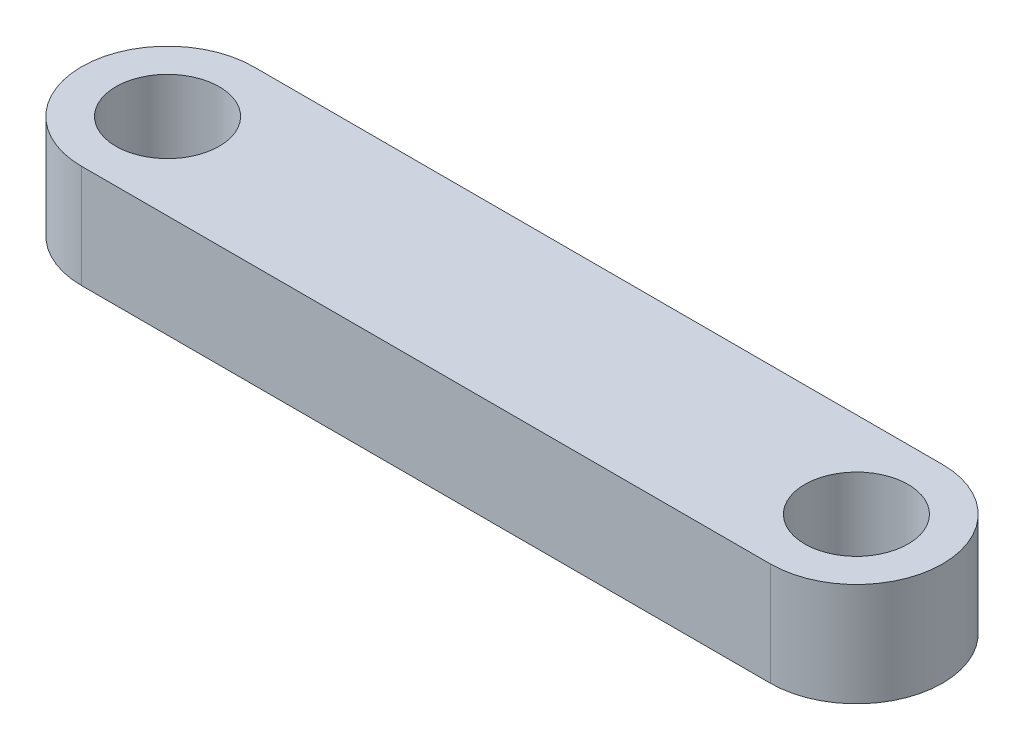
ISO-10303-21;
HEADER;
FILE_DESCRIPTION(('STEP AP214'),'2;1');
FILE_NAME('part.step','',(''),(''),'','','');
FILE_SCHEMA(('AUTOMOTIVE_DESIGN { 1 0 10303 214 1 1 1 1 }'));
ENDSEC;
DATA;
#1=APPLICATION_CONTEXT('core data for automotive mechanical design processes');
#2=APPLICATION_PROTOCOL_DEFINITION('international standard','automotive_design',2000,#1);
#3=PRODUCT_CONTEXT('',#1,'mechanical');
#4=PRODUCT('Part','Part','',(#3));
#5=PRODUCT_RELATED_PRODUCT_CATEGORY('part','',(#4));
#6=PRODUCT_DEFINITION_FORMATION('','',#4);
#7=PRODUCT_DEFINITION_CONTEXT('part definition',#1,'design');
#8=PRODUCT_DEFINITION('design','',#6,#7);
#9=PRODUCT_DEFINITION_SHAPE('','',#8);
#10=(LENGTH_UNIT() NAMED_UNIT(*) SI_UNIT(.MILLI.,.METRE.));
#11=(NAMED_UNIT(*) PLANE_ANGLE_UNIT() SI_UNIT($,.RADIAN.));
#12=(NAMED_UNIT(*) SI_UNIT($,.STERADIAN.) SOLID_ANGLE_UNIT());
#13=UNCERTAINTY_MEASURE_WITH_UNIT(LENGTH_MEASURE(1.E-05),#10,'distance_accuracy_value','');
#14=(GEOMETRIC_REPRESENTATION_CONTEXT(3) GLOBAL_UNCERTAINTY_ASSIGNED_CONTEXT((#13)) GLOBAL_UNIT_ASSIGNED_CONTEXT((#10,
#11,#12)) REPRESENTATION_CONTEXT('',''));
#15=CARTESIAN_POINT('',(0.,0.,0.));
#16=DIRECTION('',(0.,0.,1.));
#17=DIRECTION('',(1.,0.,0.));
#18=AXIS2_PLACEMENT_3D('',#15,#16,#17);
#19=CARTESIAN_POINT('',(10.,1.5,0.));
#20=DIRECTION('',(0.,1.,0.));
#21=DIRECTION('',(0.,0.,1.));
#22=AXIS2_PLACEMENT_3D('',#19,#20,#21);
#23=PLANE('',#22);
#24=CARTESIAN_POINT('',(-10.,1.5,0.));
#25=DIRECTION('',(0.,1.,0.));
#26=DIRECTION('',(0.,0.,1.));
#27=AXIS2_PLACEMENT_3D('',#24,#25,#26);
#28=CIRCLE('',#27,1.5);
#29=CARTESIAN_POINT('',(-10.,1.5,1.5));
#30=VERTEX_POINT('',#29);
#31=EDGE_CURVE('E112',#30,#30,#28,.T.);
#32=ORIENTED_EDGE('',*,*,#31,.F.);
#33=EDGE_LOOP('',(#32));
#34=FACE_BOUND('',#33,.T.);
#35=CARTESIAN_POINT('',(10.,1.5,0.));
#36=DIRECTION('',(0.,1.,0.));
#37=DIRECTION('',(0.,0.,1.));
#38=AXIS2_PLACEMENT_3D('',#35,#36,#37);
#39=CIRCLE('',#38,2.5);
#40=CARTESIAN_POINT('',(10.,1.5,2.5));
#41=VERTEX_POINT('',#40);
#42=CARTESIAN_POINT('',(10.,1.5,-2.5));
#43=VERTEX_POINT('',#42);
#44=EDGE_CURVE('E92',#41,#43,#39,.T.);
#45=ORIENTED_EDGE('',*,*,#44,.T.);
#46=DIRECTION('',(-1.,0.,0.));
#47=VECTOR('',#46,1.);
#48=CARTESIAN_POINT('',(10.,1.5,-2.5));
#49=LINE('',#48,#47);
#50=CARTESIAN_POINT('',(-10.,1.5,-2.5));
#51=VERTEX_POINT('',#50);
#52=EDGE_CURVE('E87',#43,#51,#49,.T.);
#53=ORIENTED_EDGE('',*,*,#52,.T.);
#54=CARTESIAN_POINT('',(-10.,1.5,0.));
#55=DIRECTION('',(0.,1.,0.));
#56=DIRECTION('',(0.,0.,1.));
#57=AXIS2_PLACEMENT_3D('',#54,#55,#56);
#58=CIRCLE('',#57,2.5);
#59=CARTESIAN_POINT('',(-10.,1.5,2.5));
#60=VERTEX_POINT('',#59);
#61=EDGE_CURVE('E90',#51,#60,#58,.T.);
#62=ORIENTED_EDGE('',*,*,#61,.T.);
#63=DIRECTION('',(1.,0.,0.));
#64=VECTOR('',#63,1.);
#65=CARTESIAN_POINT('',(10.,1.5,2.5));
#66=LINE('',#65,#64);
#67=EDGE_CURVE('E57',#60,#41,#66,.T.);
#68=ORIENTED_EDGE('',*,*,#67,.T.);
#69=EDGE_LOOP('',(#45,#53,#62,#68));
#70=FACE_BOUND('',#69,.T.);
#71=CARTESIAN_POINT('',(10.,1.5,0.));
#72=DIRECTION('',(0.,1.,0.));
#73=DIRECTION('',(0.,0.,1.));
#74=AXIS2_PLACEMENT_3D('',#71,#72,#73);
#75=CIRCLE('',#74,1.5);
#76=CARTESIAN_POINT('',(10.,1.5,1.5));
#77=VERTEX_POINT('',#76);
#78=EDGE_CURVE('E134',#77,#77,#75,.T.);
#79=ORIENTED_EDGE('',*,*,#78,.F.);
#80=EDGE_LOOP('',(#79));
#81=FACE_BOUND('',#80,.T.);
#82=ADVANCED_FACE('F39',(#34,#70,#81),#23,.T.);
#83=CARTESIAN_POINT('',(10.,-1.5,0.));
#84=DIRECTION('',(0.,1.,0.));
#85=DIRECTION('',(0.,0.,1.));
#86=AXIS2_PLACEMENT_3D('',#83,#84,#85);
#87=PLANE('',#86);
#88=CARTESIAN_POINT('',(10.,-1.5,0.));
#89=DIRECTION('',(0.,1.,0.));
#90=DIRECTION('',(0.,0.,1.));
#91=AXIS2_PLACEMENT_3D('',#88,#89,#90);
#92=CIRCLE('',#91,2.5);
#93=CARTESIAN_POINT('',(10.,-1.5,2.5));
#94=VERTEX_POINT('',#93);
#95=CARTESIAN_POINT('',(10.,-1.5,-2.5));
#96=VERTEX_POINT('',#95);
#97=EDGE_CURVE('E108',#94,#96,#92,.T.);
#98=ORIENTED_EDGE('',*,*,#97,.F.);
#99=DIRECTION('',(1.,0.,0.));
#100=VECTOR('',#99,1.);
#101=CARTESIAN_POINT('',(10.,-1.5,2.5));
#102=LINE('',#101,#100);
#103=CARTESIAN_POINT('',(-10.,-1.5,2.5));
#104=VERTEX_POINT('',#103);
#105=EDGE_CURVE('E80',#104,#94,#102,.T.);
#106=ORIENTED_EDGE('',*,*,#105,.F.);
#107=CARTESIAN_POINT('',(-10.,-1.5,0.));
#108=DIRECTION('',(0.,1.,0.));
#109=DIRECTION('',(0.,0.,1.));
#110=AXIS2_PLACEMENT_3D('',#107,#108,#109);
#111=CIRCLE('',#110,2.5);
#112=CARTESIAN_POINT('',(-10.,-1.5,-2.5));
#113=VERTEX_POINT('',#112);
#114=EDGE_CURVE('E74',#113,#104,#111,.T.);
#115=ORIENTED_EDGE('',*,*,#114,.F.);
#116=DIRECTION('',(-1.,0.,0.));
#117=VECTOR('',#116,1.);
#118=CARTESIAN_POINT('',(10.,-1.5,-2.5));
#119=LINE('',#118,#117);
#120=EDGE_CURVE('E97',#96,#113,#119,.T.);
#121=ORIENTED_EDGE('',*,*,#120,.F.);
#122=EDGE_LOOP('',(#98,#106,#115,#121));
#123=FACE_BOUND('',#122,.T.);
#124=CARTESIAN_POINT('',(-10.,-1.5,0.));
#125=DIRECTION('',(0.,1.,0.));
#126=DIRECTION('',(0.,0.,1.));
#127=AXIS2_PLACEMENT_3D('',#124,#125,#126);
#128=CIRCLE('',#127,1.5);
#129=CARTESIAN_POINT('',(-10.,-1.5,1.5));
#130=VERTEX_POINT('',#129);
#131=EDGE_CURVE('E130',#130,#130,#128,.T.);
#132=ORIENTED_EDGE('',*,*,#131,.T.);
#133=EDGE_LOOP('',(#132));
#134=FACE_BOUND('',#133,.T.);
#135=CARTESIAN_POINT('',(10.,-1.5,0.));
#136=DIRECTION('',(0.,1.,0.));
#137=DIRECTION('',(0.,0.,1.));
#138=AXIS2_PLACEMENT_3D('',#135,#136,#137);
#139=CIRCLE('',#138,1.5);
#140=CARTESIAN_POINT('',(10.,-1.5,1.5));
#141=VERTEX_POINT('',#140);
#142=EDGE_CURVE('E138',#141,#141,#139,.T.);
#143=ORIENTED_EDGE('',*,*,#142,.T.);
#144=EDGE_LOOP('',(#143));
#145=FACE_BOUND('',#144,.T.);
#146=ADVANCED_FACE('F125',(#123,#134,#145),#87,.F.);
#147=CARTESIAN_POINT('',(10.,1.5,0.));
#148=DIRECTION('',(0.,-1.,0.));
#149=DIRECTION('',(0.,0.,-1.));
#150=AXIS2_PLACEMENT_3D('',#147,#148,#149);
#151=CYLINDRICAL_SURFACE('',#150,2.5);
#152=ORIENTED_EDGE('',*,*,#97,.T.);
#153=DIRECTION('',(0.,-1.,0.));
#154=VECTOR('',#153,1.);
#155=CARTESIAN_POINT('',(10.,1.5,-2.5));
#156=LINE('',#155,#154);
#157=EDGE_CURVE('E11',#43,#96,#156,.T.);
#158=ORIENTED_EDGE('',*,*,#157,.F.);
#159=ORIENTED_EDGE('',*,*,#44,.F.);
#160=DIRECTION('',(0.,-1.,0.));
#161=VECTOR('',#160,1.);
#162=CARTESIAN_POINT('',(10.,1.5,2.5));
#163=LINE('',#162,#161);
#164=EDGE_CURVE('E104',#41,#94,#163,.T.);
#165=ORIENTED_EDGE('',*,*,#164,.T.);
#166=EDGE_LOOP('',(#152,#158,#159,#165));
#167=FACE_BOUND('',#166,.T.);
#168=ADVANCED_FACE('F41',(#167),#151,.T.);
#169=CARTESIAN_POINT('',(10.,1.5,-2.5));
#170=DIRECTION('',(0.,0.,1.));
#171=DIRECTION('',(1.,0.,0.));
#172=AXIS2_PLACEMENT_3D('',#169,#170,#171);
#173=PLANE('',#172);
#174=ORIENTED_EDGE('',*,*,#120,.T.);
#175=DIRECTION('',(0.,-1.,0.));
#176=VECTOR('',#175,1.);
#177=CARTESIAN_POINT('',(-10.,1.5,-2.5));
#178=LINE('',#177,#176);
#179=EDGE_CURVE('E49',#51,#113,#178,.T.);
#180=ORIENTED_EDGE('',*,*,#179,.F.);
#181=ORIENTED_EDGE('',*,*,#52,.F.);
#182=ORIENTED_EDGE('',*,*,#157,.T.);
#183=EDGE_LOOP('',(#174,#180,#181,#182));
#184=FACE_BOUND('',#183,.T.);
#185=ADVANCED_FACE('F96',(#184),#173,.F.);
#186=CARTESIAN_POINT('',(-10.,1.5,0.));
#187=DIRECTION('',(0.,-1.,0.));
#188=DIRECTION('',(0.,0.,-1.));
#189=AXIS2_PLACEMENT_3D('',#186,#187,#188);
#190=CYLINDRICAL_SURFACE('',#189,2.5);
#191=ORIENTED_EDGE('',*,*,#114,.T.);
#192=DIRECTION('',(0.,-1.,0.));
#193=VECTOR('',#192,1.);
#194=CARTESIAN_POINT('',(-10.,1.5,2.5));
#195=LINE('',#194,#193);
#196=EDGE_CURVE('E99',#60,#104,#195,.T.);
#197=ORIENTED_EDGE('',*,*,#196,.F.);
#198=ORIENTED_EDGE('',*,*,#61,.F.);
#199=ORIENTED_EDGE('',*,*,#179,.T.);
#200=EDGE_LOOP('',(#191,#197,#198,#199));
#201=FACE_BOUND('',#200,.T.);
#202=ADVANCED_FACE('F100',(#201),#190,.T.);
#203=CARTESIAN_POINT('',(10.,1.5,2.5));
#204=DIRECTION('',(0.,0.,-1.));
#205=DIRECTION('',(-1.,0.,0.));
#206=AXIS2_PLACEMENT_3D('',#203,#204,#205);
#207=PLANE('',#206);
#208=ORIENTED_EDGE('',*,*,#105,.T.);
#209=ORIENTED_EDGE('',*,*,#164,.F.);
#210=ORIENTED_EDGE('',*,*,#67,.F.);
#211=ORIENTED_EDGE('',*,*,#196,.T.);
#212=EDGE_LOOP('',(#208,#209,#210,#211));
#213=FACE_BOUND('',#212,.T.);
#214=ADVANCED_FACE('F122',(#213),#207,.F.);
#215=CARTESIAN_POINT('',(-10.,1.5,0.));
#216=DIRECTION('',(0.,-1.,0.));
#217=DIRECTION('',(0.,0.,-1.));
#218=AXIS2_PLACEMENT_3D('',#215,#216,#217);
#219=CYLINDRICAL_SURFACE('',#218,1.5);
#220=ORIENTED_EDGE('',*,*,#31,.T.);
#221=EDGE_LOOP('',(#220));
#222=FACE_BOUND('',#221,.T.);
#223=ORIENTED_EDGE('',*,*,#131,.F.);
#224=EDGE_LOOP('',(#223));
#225=FACE_BOUND('',#224,.T.);
#226=ADVANCED_FACE('F157',(#222,#225),#219,.F.);
#227=CARTESIAN_POINT('',(10.,1.5,0.));
#228=DIRECTION('',(0.,-1.,0.));
#229=DIRECTION('',(0.,0.,-1.));
#230=AXIS2_PLACEMENT_3D('',#227,#228,#229);
#231=CYLINDRICAL_SURFACE('',#230,1.5);
#232=ORIENTED_EDGE('',*,*,#78,.T.);
#233=EDGE_LOOP('',(#232));
#234=FACE_BOUND('',#233,.T.);
#235=ORIENTED_EDGE('',*,*,#142,.F.);
#236=EDGE_LOOP('',(#235));
#237=FACE_BOUND('',#236,.T.);
#238=ADVANCED_FACE('F146',(#234,#237),#231,.F.);
#239=CLOSED_SHELL('',(#82,#146,#168,#185,#202,#214,#226,#238));
#240=MANIFOLD_SOLID_BREP('B2',#239);
#241=ADVANCED_BREP_SHAPE_REPRESENTATION('',(#18,#240),#14);
#242=SHAPE_DEFINITION_REPRESENTATION(#9,#241);
ENDSEC;
END-ISO-10303-21;
